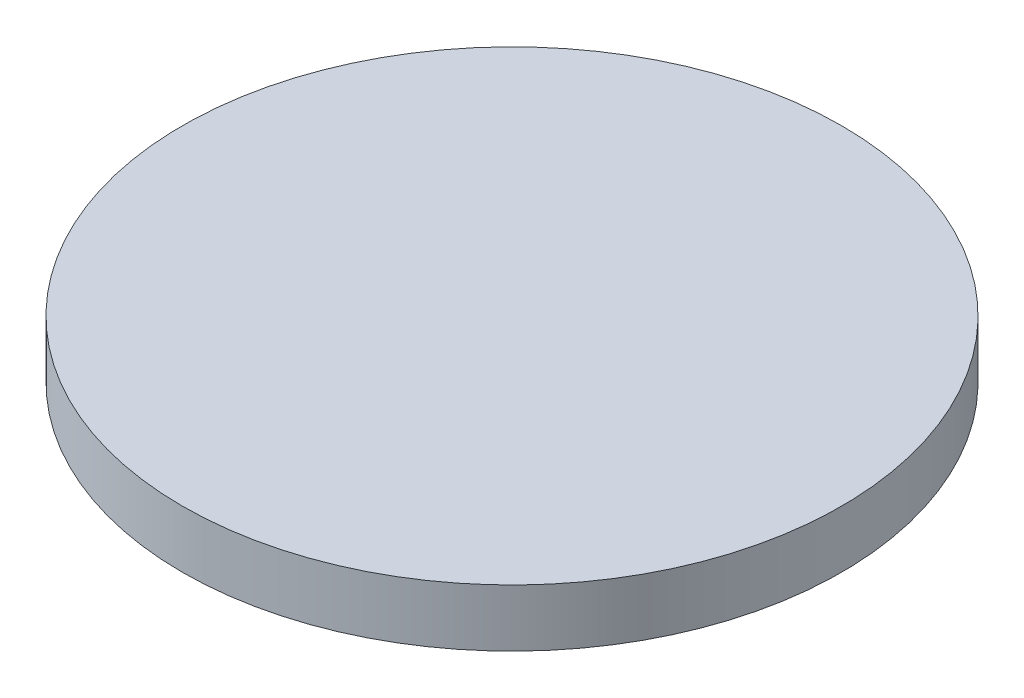
ISO-10303-21;
HEADER;
FILE_DESCRIPTION(('STEP AP214'),'2;1');
FILE_NAME('part.step','',(''),(''),'','','');
FILE_SCHEMA(('AUTOMOTIVE_DESIGN { 1 0 10303 214 1 1 1 1 }'));
ENDSEC;
DATA;
#1=APPLICATION_CONTEXT('core data for automotive mechanical design processes');
#2=APPLICATION_PROTOCOL_DEFINITION('international standard','automotive_design',2000,#1);
#3=PRODUCT_CONTEXT('',#1,'mechanical');
#4=PRODUCT('Part','Part','',(#3));
#5=PRODUCT_RELATED_PRODUCT_CATEGORY('part','',(#4));
#6=PRODUCT_DEFINITION_FORMATION('','',#4);
#7=PRODUCT_DEFINITION_CONTEXT('part definition',#1,'design');
#8=PRODUCT_DEFINITION('design','',#6,#7);
#9=PRODUCT_DEFINITION_SHAPE('','',#8);
#10=(LENGTH_UNIT() NAMED_UNIT(*) SI_UNIT(.MILLI.,.METRE.));
#11=(NAMED_UNIT(*) PLANE_ANGLE_UNIT() SI_UNIT($,.RADIAN.));
#12=(NAMED_UNIT(*) SI_UNIT($,.STERADIAN.) SOLID_ANGLE_UNIT());
#13=UNCERTAINTY_MEASURE_WITH_UNIT(LENGTH_MEASURE(1.E-05),#10,'distance_accuracy_value','');
#14=(GEOMETRIC_REPRESENTATION_CONTEXT(3) GLOBAL_UNCERTAINTY_ASSIGNED_CONTEXT((#13)) GLOBAL_UNIT_ASSIGNED_CONTEXT((#10,
#11,#12)) REPRESENTATION_CONTEXT('',''));
#15=CARTESIAN_POINT('',(0.,0.,0.));
#16=DIRECTION('',(0.,0.,1.));
#17=DIRECTION('',(1.,0.,0.));
#18=AXIS2_PLACEMENT_3D('',#15,#16,#17);
#19=CARTESIAN_POINT('',(0.,2.,0.));
#20=DIRECTION('',(0.,-1.,0.));
#21=DIRECTION('',(0.,0.,-1.));
#22=AXIS2_PLACEMENT_3D('',#19,#20,#21);
#23=CYLINDRICAL_SURFACE('',#22,11.5);
#24=CARTESIAN_POINT('',(0.,2.,0.));
#25=DIRECTION('',(0.,1.,0.));
#26=DIRECTION('',(0.,0.,1.));
#27=AXIS2_PLACEMENT_3D('',#24,#25,#26);
#28=CIRCLE('',#27,11.5);
#29=CARTESIAN_POINT('',(0.,2.,11.5));
#30=VERTEX_POINT('',#29);
#31=EDGE_CURVE('E10',#30,#30,#28,.T.);
#32=ORIENTED_EDGE('',*,*,#31,.F.);
#33=EDGE_LOOP('',(#32));
#34=FACE_BOUND('',#33,.T.);
#35=CARTESIAN_POINT('',(0.,0.,0.));
#36=DIRECTION('',(0.,1.,0.));
#37=DIRECTION('',(0.,0.,1.));
#38=AXIS2_PLACEMENT_3D('',#35,#36,#37);
#39=CIRCLE('',#38,11.5);
#40=CARTESIAN_POINT('',(0.,0.,11.5));
#41=VERTEX_POINT('',#40);
#42=EDGE_CURVE('E38',#41,#41,#39,.T.);
#43=ORIENTED_EDGE('',*,*,#42,.T.);
#44=EDGE_LOOP('',(#43));
#45=FACE_BOUND('',#44,.T.);
#46=ADVANCED_FACE('F35',(#34,#45),#23,.T.);
#47=CARTESIAN_POINT('',(0.,2.,0.));
#48=DIRECTION('',(0.,1.,0.));
#49=DIRECTION('',(0.,0.,1.));
#50=AXIS2_PLACEMENT_3D('',#47,#48,#49);
#51=PLANE('',#50);
#52=ORIENTED_EDGE('',*,*,#31,.T.);
#53=EDGE_LOOP('',(#52));
#54=FACE_BOUND('',#53,.T.);
#55=ADVANCED_FACE('F50',(#54),#51,.T.);
#56=CARTESIAN_POINT('',(0.,0.,0.));
#57=DIRECTION('',(0.,1.,0.));
#58=DIRECTION('',(0.,0.,1.));
#59=AXIS2_PLACEMENT_3D('',#56,#57,#58);
#60=PLANE('',#59);
#61=ORIENTED_EDGE('',*,*,#42,.F.);
#62=EDGE_LOOP('',(#61));
#63=FACE_BOUND('',#62,.T.);
#64=ADVANCED_FACE('F48',(#63),#60,.F.);
#65=CLOSED_SHELL('',(#46,#55,#64));
#66=MANIFOLD_SOLID_BREP('B2',#65);
#67=ADVANCED_BREP_SHAPE_REPRESENTATION('',(#18,#66),#14);
#68=SHAPE_DEFINITION_REPRESENTATION(#9,#67);
ENDSEC;
END-ISO-10303-21;
